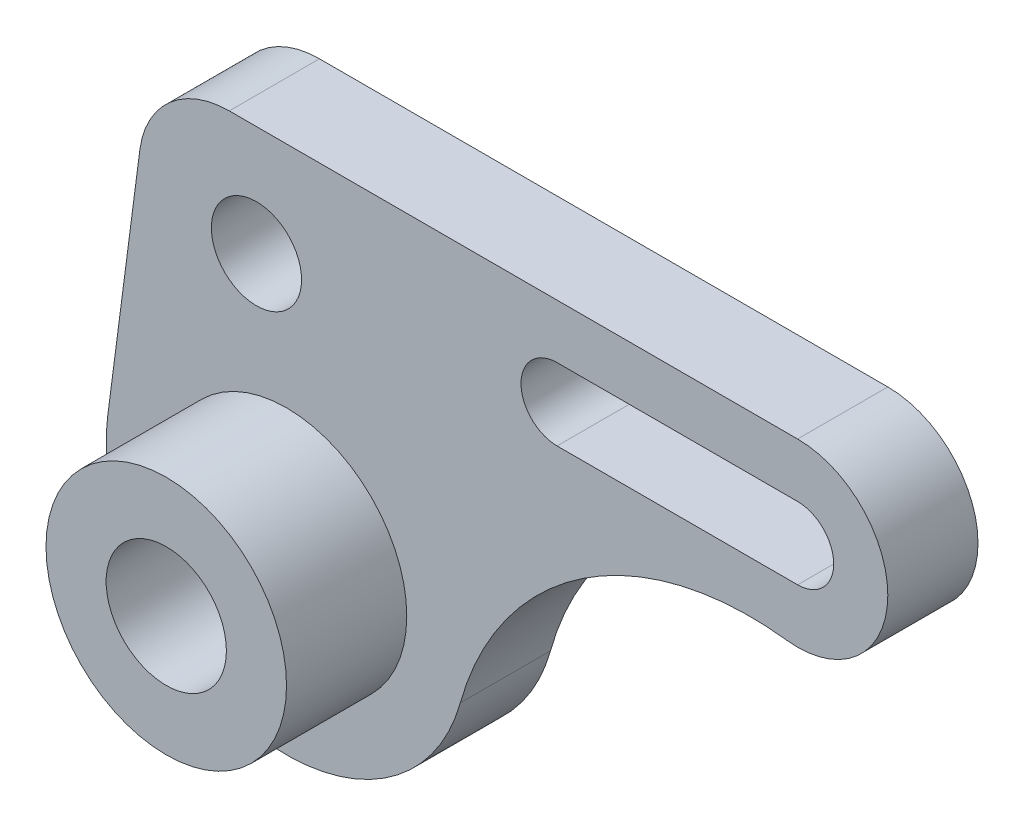
ISO-10303-21;
HEADER;
FILE_DESCRIPTION(('STEP AP214'),'2;1');
FILE_NAME('part.step','',(''),(''),'','','');
FILE_SCHEMA(('AUTOMOTIVE_DESIGN { 1 0 10303 214 1 1 1 1 }'));
ENDSEC;
DATA;
#1=APPLICATION_CONTEXT('core data for automotive mechanical design processes');
#2=APPLICATION_PROTOCOL_DEFINITION('international standard','automotive_design',2000,#1);
#3=PRODUCT_CONTEXT('',#1,'mechanical');
#4=PRODUCT('Part','Part','',(#3));
#5=PRODUCT_RELATED_PRODUCT_CATEGORY('part','',(#4));
#6=PRODUCT_DEFINITION_FORMATION('','',#4);
#7=PRODUCT_DEFINITION_CONTEXT('part definition',#1,'design');
#8=PRODUCT_DEFINITION('design','',#6,#7);
#9=PRODUCT_DEFINITION_SHAPE('','',#8);
#10=(LENGTH_UNIT() NAMED_UNIT(*) SI_UNIT(.MILLI.,.METRE.));
#11=(NAMED_UNIT(*) PLANE_ANGLE_UNIT() SI_UNIT($,.RADIAN.));
#12=(NAMED_UNIT(*) SI_UNIT($,.STERADIAN.) SOLID_ANGLE_UNIT());
#13=UNCERTAINTY_MEASURE_WITH_UNIT(LENGTH_MEASURE(1.E-05),#10,'distance_accuracy_value','');
#14=(GEOMETRIC_REPRESENTATION_CONTEXT(3) GLOBAL_UNCERTAINTY_ASSIGNED_CONTEXT((#13)) GLOBAL_UNIT_ASSIGNED_CONTEXT((#10,
#11,#12)) REPRESENTATION_CONTEXT('',''));
#15=CARTESIAN_POINT('',(0.,0.,0.));
#16=DIRECTION('',(0.,0.,1.));
#17=DIRECTION('',(1.,0.,0.));
#18=AXIS2_PLACEMENT_3D('',#15,#16,#17);
#19=CARTESIAN_POINT('',(-9.51937082683579,43.0012242569308,15.));
#20=DIRECTION('',(0.,0.,-1.));
#21=DIRECTION('',(-1.,0.,0.));
#22=AXIS2_PLACEMENT_3D('',#19,#20,#21);
#23=CYLINDRICAL_SURFACE('',#22,15.);
#24=CARTESIAN_POINT('',(-9.51937082683579,43.0012242569308,0.));
#25=DIRECTION('',(0.,0.,1.));
#26=DIRECTION('',(-1.,0.,0.));
#27=AXIS2_PLACEMENT_3D('',#24,#25,#26);
#28=CIRCLE('',#27,15.);
#29=CARTESIAN_POINT('',(-9.5193708268357,58.0012242569308,0.));
#30=VERTEX_POINT('',#29);
#31=CARTESIAN_POINT('',(-24.3934311160689,44.9408970417732,0.));
#32=VERTEX_POINT('',#31);
#33=EDGE_CURVE('E167',#30,#32,#28,.T.);
#34=ORIENTED_EDGE('',*,*,#33,.T.);
#35=DIRECTION('',(0.,0.,-1.));
#36=VECTOR('',#35,1.);
#37=CARTESIAN_POINT('',(-24.3934311160689,44.9408970417732,15.));
#38=LINE('',#37,#36);
#39=CARTESIAN_POINT('',(-24.3934311160689,44.9408970417732,15.));
#40=VERTEX_POINT('',#39);
#41=EDGE_CURVE('E44',#40,#32,#38,.T.);
#42=ORIENTED_EDGE('',*,*,#41,.F.);
#43=CARTESIAN_POINT('',(-9.51937082683579,43.0012242569308,15.));
#44=DIRECTION('',(0.,0.,1.));
#45=DIRECTION('',(-1.,0.,0.));
#46=AXIS2_PLACEMENT_3D('',#43,#44,#45);
#47=CIRCLE('',#46,15.);
#48=CARTESIAN_POINT('',(-9.5193708268357,58.0012242569308,15.));
#49=VERTEX_POINT('',#48);
#50=EDGE_CURVE('E152',#49,#40,#47,.T.);
#51=ORIENTED_EDGE('',*,*,#50,.F.);
#52=DIRECTION('',(0.,0.,-1.));
#53=VECTOR('',#52,1.);
#54=CARTESIAN_POINT('',(-9.5193708268357,58.0012242569308,15.));
#55=LINE('',#54,#53);
#56=EDGE_CURVE('E166',#49,#30,#55,.T.);
#57=ORIENTED_EDGE('',*,*,#56,.T.);
#58=EDGE_LOOP('',(#34,#42,#51,#57));
#59=FACE_BOUND('',#58,.T.);
#60=ADVANCED_FACE('F37',(#59),#23,.T.);
#61=CARTESIAN_POINT('',(-29.7481205784662,3.87934556968499,15.));
#62=DIRECTION('',(0.991604019282207,-0.1293115189895,0.));
#63=DIRECTION('',(0.1293115189895,0.991604019282207,0.));
#64=AXIS2_PLACEMENT_3D('',#61,#62,#63);
#65=PLANE('',#64);
#66=DIRECTION('',(-0.1293115189895,-0.991604019282207,0.));
#67=VECTOR('',#66,1.);
#68=CARTESIAN_POINT('',(-29.7481205784662,3.87934556968499,0.));
#69=LINE('',#68,#67);
#70=CARTESIAN_POINT('',(-29.7481205784662,3.87934556968499,0.));
#71=VERTEX_POINT('',#70);
#72=EDGE_CURVE('E170',#32,#71,#69,.T.);
#73=ORIENTED_EDGE('',*,*,#72,.T.);
#74=DIRECTION('',(0.,0.,-1.));
#75=VECTOR('',#74,1.);
#76=CARTESIAN_POINT('',(-29.7481205784662,3.87934556968499,15.));
#77=LINE('',#76,#75);
#78=CARTESIAN_POINT('',(-29.7481205784662,3.87934556968499,15.));
#79=VERTEX_POINT('',#78);
#80=EDGE_CURVE('E191',#79,#71,#77,.T.);
#81=ORIENTED_EDGE('',*,*,#80,.F.);
#82=DIRECTION('',(-0.1293115189895,-0.991604019282207,0.));
#83=VECTOR('',#82,1.);
#84=CARTESIAN_POINT('',(-29.7481205784662,3.87934556968499,15.));
#85=LINE('',#84,#83);
#86=EDGE_CURVE('E155',#40,#79,#85,.T.);
#87=ORIENTED_EDGE('',*,*,#86,.F.);
#88=ORIENTED_EDGE('',*,*,#41,.T.);
#89=EDGE_LOOP('',(#73,#81,#87,#88));
#90=FACE_BOUND('',#89,.T.);
#91=ADVANCED_FACE('F196',(#90),#65,.F.);
#92=CARTESIAN_POINT('',(0.,0.,15.));
#93=DIRECTION('',(0.,0.,-1.));
#94=DIRECTION('',(-1.,0.,0.));
#95=AXIS2_PLACEMENT_3D('',#92,#93,#94);
#96=CYLINDRICAL_SURFACE('',#95,30.);
#97=CARTESIAN_POINT('',(0.,0.,0.));
#98=DIRECTION('',(0.,0.,1.));
#99=DIRECTION('',(1.,0.,0.));
#100=AXIS2_PLACEMENT_3D('',#97,#98,#99);
#101=CIRCLE('',#100,30.);
#102=CARTESIAN_POINT('',(28.8951244348913,-8.06670836786278,0.));
#103=VERTEX_POINT('',#102);
#104=EDGE_CURVE('E173',#71,#103,#101,.T.);
#105=ORIENTED_EDGE('',*,*,#104,.T.);
#106=DIRECTION('',(0.,0.,-1.));
#107=VECTOR('',#106,1.);
#108=CARTESIAN_POINT('',(28.8951244348913,-8.06670836786278,15.));
#109=LINE('',#108,#107);
#110=CARTESIAN_POINT('',(28.8951244348913,-8.06670836786278,15.));
#111=VERTEX_POINT('',#110);
#112=EDGE_CURVE('E188',#111,#103,#109,.T.);
#113=ORIENTED_EDGE('',*,*,#112,.F.);
#114=CARTESIAN_POINT('',(0.,0.,15.));
#115=DIRECTION('',(0.,0.,1.));
#116=DIRECTION('',(1.,0.,0.));
#117=AXIS2_PLACEMENT_3D('',#114,#115,#116);
#118=CIRCLE('',#117,30.);
#119=EDGE_CURVE('E158',#79,#111,#118,.T.);
#120=ORIENTED_EDGE('',*,*,#119,.F.);
#121=ORIENTED_EDGE('',*,*,#80,.T.);
#122=EDGE_LOOP('',(#105,#113,#120,#121));
#123=FACE_BOUND('',#122,.T.);
#124=ADVANCED_FACE('F208',(#123),#96,.T.);
#125=CARTESIAN_POINT('',(77.0536651597102,-21.5112223143007,15.));
#126=DIRECTION('',(0.,0.,-1.));
#127=DIRECTION('',(-1.,0.,0.));
#128=AXIS2_PLACEMENT_3D('',#125,#126,#127);
#129=CYLINDRICAL_SURFACE('',#128,50.);
#130=CARTESIAN_POINT('',(77.0536651597102,-21.5112223143007,0.));
#131=DIRECTION('',(0.,0.,-1.));
#132=DIRECTION('',(1.,0.,0.));
#133=AXIS2_PLACEMENT_3D('',#130,#131,#132);
#134=CIRCLE('',#133,50.);
#135=CARTESIAN_POINT('',(83.1662304214716,28.1137365866466,0.));
#136=VERTEX_POINT('',#135);
#137=EDGE_CURVE('E175',#103,#136,#134,.T.);
#138=ORIENTED_EDGE('',*,*,#137,.T.);
#139=DIRECTION('',(0.,0.,-1.));
#140=VECTOR('',#139,1.);
#141=CARTESIAN_POINT('',(83.1662304214716,28.1137365866466,15.));
#142=LINE('',#141,#140);
#143=CARTESIAN_POINT('',(83.1662304214716,28.1137365866466,15.));
#144=VERTEX_POINT('',#143);
#145=EDGE_CURVE('E185',#144,#136,#142,.T.);
#146=ORIENTED_EDGE('',*,*,#145,.F.);
#147=CARTESIAN_POINT('',(77.0536651597102,-21.5112223143007,15.));
#148=DIRECTION('',(0.,0.,-1.));
#149=DIRECTION('',(1.,0.,0.));
#150=AXIS2_PLACEMENT_3D('',#147,#148,#149);
#151=CIRCLE('',#150,50.);
#152=EDGE_CURVE('E160',#111,#144,#151,.T.);
#153=ORIENTED_EDGE('',*,*,#152,.F.);
#154=ORIENTED_EDGE('',*,*,#112,.T.);
#155=EDGE_LOOP('',(#138,#146,#153,#154));
#156=FACE_BOUND('',#155,.T.);
#157=ADVANCED_FACE('F212',(#156),#129,.F.);
#158=CARTESIAN_POINT('',(85.,43.0012242569308,15.));
#159=DIRECTION('',(0.,0.,-1.));
#160=DIRECTION('',(-1.,0.,0.));
#161=AXIS2_PLACEMENT_3D('',#158,#159,#160);
#162=CYLINDRICAL_SURFACE('',#161,15.);
#163=CARTESIAN_POINT('',(85.,43.0012242569308,0.));
#164=DIRECTION('',(0.,0.,1.));
#165=DIRECTION('',(-1.,0.,0.));
#166=AXIS2_PLACEMENT_3D('',#163,#164,#165);
#167=CIRCLE('',#166,15.);
#168=CARTESIAN_POINT('',(85.,58.0012242569308,0.));
#169=VERTEX_POINT('',#168);
#170=EDGE_CURVE('E177',#136,#169,#167,.T.);
#171=ORIENTED_EDGE('',*,*,#170,.T.);
#172=DIRECTION('',(0.,0.,-1.));
#173=VECTOR('',#172,1.);
#174=CARTESIAN_POINT('',(85.,58.0012242569308,15.));
#175=LINE('',#174,#173);
#176=CARTESIAN_POINT('',(85.,58.0012242569308,15.));
#177=VERTEX_POINT('',#176);
#178=EDGE_CURVE('E182',#177,#169,#175,.T.);
#179=ORIENTED_EDGE('',*,*,#178,.F.);
#180=CARTESIAN_POINT('',(85.,43.0012242569308,15.));
#181=DIRECTION('',(0.,0.,1.));
#182=DIRECTION('',(-1.,0.,0.));
#183=AXIS2_PLACEMENT_3D('',#180,#181,#182);
#184=CIRCLE('',#183,15.);
#185=EDGE_CURVE('E162',#144,#177,#184,.T.);
#186=ORIENTED_EDGE('',*,*,#185,.F.);
#187=ORIENTED_EDGE('',*,*,#145,.T.);
#188=EDGE_LOOP('',(#171,#179,#186,#187));
#189=FACE_BOUND('',#188,.T.);
#190=ADVANCED_FACE('F222',(#189),#162,.T.);
#191=CARTESIAN_POINT('',(-9.5193708268357,58.0012242569308,15.));
#192=DIRECTION('',(0.,-1.,0.));
#193=DIRECTION('',(0.,0.,-1.));
#194=AXIS2_PLACEMENT_3D('',#191,#192,#193);
#195=PLANE('',#194);
#196=DIRECTION('',(-1.,0.,0.));
#197=VECTOR('',#196,1.);
#198=CARTESIAN_POINT('',(-9.5193708268357,58.0012242569308,0.));
#199=LINE('',#198,#197);
#200=EDGE_CURVE('E156',#169,#30,#199,.T.);
#201=ORIENTED_EDGE('',*,*,#200,.T.);
#202=ORIENTED_EDGE('',*,*,#56,.F.);
#203=DIRECTION('',(-1.,0.,0.));
#204=VECTOR('',#203,1.);
#205=CARTESIAN_POINT('',(-9.5193708268357,58.0012242569308,15.));
#206=LINE('',#205,#204);
#207=EDGE_CURVE('E164',#177,#49,#206,.T.);
#208=ORIENTED_EDGE('',*,*,#207,.F.);
#209=ORIENTED_EDGE('',*,*,#178,.T.);
#210=EDGE_LOOP('',(#201,#202,#208,#209));
#211=FACE_BOUND('',#210,.T.);
#212=ADVANCED_FACE('F220',(#211),#195,.F.);
#213=CARTESIAN_POINT('',(-9.51937082683579,43.0012242569308,15.));
#214=DIRECTION('',(0.,0.,-1.));
#215=DIRECTION('',(-1.,0.,0.));
#216=AXIS2_PLACEMENT_3D('',#213,#214,#215);
#217=PLANE('',#216);
#218=CARTESIAN_POINT('',(0.,0.,15.));
#219=DIRECTION('',(0.,0.,-1.));
#220=DIRECTION('',(-1.,0.,0.));
#221=AXIS2_PLACEMENT_3D('',#218,#219,#220);
#222=CIRCLE('',#221,20.);
#223=CARTESIAN_POINT('',(-20.,0.,15.));
#224=VERTEX_POINT('',#223);
#225=EDGE_CURVE('E11',#224,#224,#222,.F.);
#226=ORIENTED_EDGE('',*,*,#225,.F.);
#227=EDGE_LOOP('',(#226));
#228=FACE_BOUND('',#227,.T.);
#229=CARTESIAN_POINT('',(-5.00000000000001,39.6862696659689,15.));
#230=DIRECTION('',(0.,0.,1.));
#231=DIRECTION('',(1.,0.,0.));
#232=AXIS2_PLACEMENT_3D('',#229,#230,#231);
#233=CIRCLE('',#232,7.5);
#234=CARTESIAN_POINT('',(2.49999999999999,39.6862696659689,15.));
#235=VERTEX_POINT('',#234);
#236=EDGE_CURVE('E136',#235,#235,#233,.T.);
#237=ORIENTED_EDGE('',*,*,#236,.F.);
#238=EDGE_LOOP('',(#237));
#239=FACE_BOUND('',#238,.T.);
#240=CARTESIAN_POINT('',(45.,43.0012242569308,15.));
#241=DIRECTION('',(0.,0.,1.));
#242=DIRECTION('',(1.,0.,0.));
#243=AXIS2_PLACEMENT_3D('',#240,#241,#242);
#244=CIRCLE('',#243,6.);
#245=CARTESIAN_POINT('',(45.,49.0012242569308,15.));
#246=VERTEX_POINT('',#245);
#247=CARTESIAN_POINT('',(45.,37.0012242569308,15.));
#248=VERTEX_POINT('',#247);
#249=EDGE_CURVE('E142',#246,#248,#244,.T.);
#250=ORIENTED_EDGE('',*,*,#249,.F.);
#251=DIRECTION('',(-1.,0.,0.));
#252=VECTOR('',#251,1.);
#253=CARTESIAN_POINT('',(0.,49.0012242569308,15.));
#254=LINE('',#253,#252);
#255=CARTESIAN_POINT('',(85.,49.0012242569308,15.));
#256=VERTEX_POINT('',#255);
#257=EDGE_CURVE('E51',#256,#246,#254,.T.);
#258=ORIENTED_EDGE('',*,*,#257,.F.);
#259=CARTESIAN_POINT('',(85.,43.0012242569308,15.));
#260=DIRECTION('',(0.,0.,1.));
#261=DIRECTION('',(1.,0.,0.));
#262=AXIS2_PLACEMENT_3D('',#259,#260,#261);
#263=CIRCLE('',#262,6.);
#264=CARTESIAN_POINT('',(85.,37.0012242569308,15.));
#265=VERTEX_POINT('',#264);
#266=EDGE_CURVE('E130',#265,#256,#263,.T.);
#267=ORIENTED_EDGE('',*,*,#266,.F.);
#268=DIRECTION('',(-1.,0.,0.));
#269=VECTOR('',#268,1.);
#270=CARTESIAN_POINT('',(0.,37.0012242569308,15.));
#271=LINE('',#270,#269);
#272=EDGE_CURVE('E133',#265,#248,#271,.T.);
#273=ORIENTED_EDGE('',*,*,#272,.T.);
#274=EDGE_LOOP('',(#250,#258,#267,#273));
#275=FACE_BOUND('',#274,.T.);
#276=ORIENTED_EDGE('',*,*,#50,.T.);
#277=ORIENTED_EDGE('',*,*,#86,.T.);
#278=ORIENTED_EDGE('',*,*,#119,.T.);
#279=ORIENTED_EDGE('',*,*,#152,.T.);
#280=ORIENTED_EDGE('',*,*,#185,.T.);
#281=ORIENTED_EDGE('',*,*,#207,.T.);
#282=EDGE_LOOP('',(#276,#277,#278,#279,#280,#281));
#283=FACE_BOUND('',#282,.T.);
#284=ADVANCED_FACE('F216',(#228,#239,#275,#283),#217,.F.);
#285=CARTESIAN_POINT('',(-9.51937082683579,43.0012242569308,0.));
#286=DIRECTION('',(0.,0.,-1.));
#287=DIRECTION('',(-1.,0.,0.));
#288=AXIS2_PLACEMENT_3D('',#285,#286,#287);
#289=PLANE('',#288);
#290=CARTESIAN_POINT('',(0.,0.,0.));
#291=DIRECTION('',(0.,0.,1.));
#292=DIRECTION('',(1.,0.,0.));
#293=AXIS2_PLACEMENT_3D('',#290,#291,#292);
#294=CIRCLE('',#293,10.);
#295=CARTESIAN_POINT('',(10.,0.,0.));
#296=VERTEX_POINT('',#295);
#297=EDGE_CURVE('E356',#296,#296,#294,.T.);
#298=ORIENTED_EDGE('',*,*,#297,.T.);
#299=EDGE_LOOP('',(#298));
#300=FACE_BOUND('',#299,.T.);
#301=CARTESIAN_POINT('',(-5.00000000000001,39.6862696659689,0.));
#302=DIRECTION('',(0.,0.,1.));
#303=DIRECTION('',(1.,0.,0.));
#304=AXIS2_PLACEMENT_3D('',#301,#302,#303);
#305=CIRCLE('',#304,7.5);
#306=CARTESIAN_POINT('',(2.49999999999999,39.6862696659689,0.));
#307=VERTEX_POINT('',#306);
#308=EDGE_CURVE('E171',#307,#307,#305,.T.);
#309=ORIENTED_EDGE('',*,*,#308,.T.);
#310=EDGE_LOOP('',(#309));
#311=FACE_BOUND('',#310,.T.);
#312=DIRECTION('',(-1.,0.,0.));
#313=VECTOR('',#312,1.);
#314=CARTESIAN_POINT('',(0.,49.0012242569308,0.));
#315=LINE('',#314,#313);
#316=CARTESIAN_POINT('',(85.,49.0012242569308,0.));
#317=VERTEX_POINT('',#316);
#318=CARTESIAN_POINT('',(45.,49.0012242569308,0.));
#319=VERTEX_POINT('',#318);
#320=EDGE_CURVE('E115',#317,#319,#315,.T.);
#321=ORIENTED_EDGE('',*,*,#320,.T.);
#322=CARTESIAN_POINT('',(45.,43.0012242569308,0.));
#323=DIRECTION('',(0.,0.,1.));
#324=DIRECTION('',(1.,0.,0.));
#325=AXIS2_PLACEMENT_3D('',#322,#323,#324);
#326=CIRCLE('',#325,6.);
#327=CARTESIAN_POINT('',(45.,37.0012242569308,0.));
#328=VERTEX_POINT('',#327);
#329=EDGE_CURVE('E121',#319,#328,#326,.T.);
#330=ORIENTED_EDGE('',*,*,#329,.T.);
#331=DIRECTION('',(-1.,0.,0.));
#332=VECTOR('',#331,1.);
#333=CARTESIAN_POINT('',(0.,37.0012242569308,0.));
#334=LINE('',#333,#332);
#335=CARTESIAN_POINT('',(85.,37.0012242569308,0.));
#336=VERTEX_POINT('',#335);
#337=EDGE_CURVE('E125',#336,#328,#334,.T.);
#338=ORIENTED_EDGE('',*,*,#337,.F.);
#339=CARTESIAN_POINT('',(85.,43.0012242569308,0.));
#340=DIRECTION('',(0.,0.,1.));
#341=DIRECTION('',(1.,0.,0.));
#342=AXIS2_PLACEMENT_3D('',#339,#340,#341);
#343=CIRCLE('',#342,6.);
#344=EDGE_CURVE('E118',#336,#317,#343,.T.);
#345=ORIENTED_EDGE('',*,*,#344,.T.);
#346=EDGE_LOOP('',(#321,#330,#338,#345));
#347=FACE_BOUND('',#346,.T.);
#348=ORIENTED_EDGE('',*,*,#33,.F.);
#349=ORIENTED_EDGE('',*,*,#200,.F.);
#350=ORIENTED_EDGE('',*,*,#170,.F.);
#351=ORIENTED_EDGE('',*,*,#137,.F.);
#352=ORIENTED_EDGE('',*,*,#104,.F.);
#353=ORIENTED_EDGE('',*,*,#72,.F.);
#354=EDGE_LOOP('',(#348,#349,#350,#351,#352,#353));
#355=FACE_BOUND('',#354,.T.);
#356=ADVANCED_FACE('F127',(#300,#311,#347,#355),#289,.T.);
#357=CARTESIAN_POINT('',(0.,49.0012242569308,0.));
#358=DIRECTION('',(0.,1.,0.));
#359=DIRECTION('',(-1.,0.,0.));
#360=AXIS2_PLACEMENT_3D('',#357,#358,#359);
#361=PLANE('',#360);
#362=ORIENTED_EDGE('',*,*,#257,.T.);
#363=DIRECTION('',(0.,0.,1.));
#364=VECTOR('',#363,1.);
#365=CARTESIAN_POINT('',(45.,49.0012242569308,0.));
#366=LINE('',#365,#364);
#367=EDGE_CURVE('E112',#319,#246,#366,.T.);
#368=ORIENTED_EDGE('',*,*,#367,.F.);
#369=ORIENTED_EDGE('',*,*,#320,.F.);
#370=DIRECTION('',(0.,0.,1.));
#371=VECTOR('',#370,1.);
#372=CARTESIAN_POINT('',(85.,49.0012242569308,0.));
#373=LINE('',#372,#371);
#374=EDGE_CURVE('E147',#317,#256,#373,.T.);
#375=ORIENTED_EDGE('',*,*,#374,.T.);
#376=EDGE_LOOP('',(#362,#368,#369,#375));
#377=FACE_BOUND('',#376,.T.);
#378=ADVANCED_FACE('F113',(#377),#361,.F.);
#379=CARTESIAN_POINT('',(85.,43.0012242569308,0.));
#380=DIRECTION('',(0.,0.,1.));
#381=DIRECTION('',(1.,0.,0.));
#382=AXIS2_PLACEMENT_3D('',#379,#380,#381);
#383=CYLINDRICAL_SURFACE('',#382,6.);
#384=ORIENTED_EDGE('',*,*,#266,.T.);
#385=ORIENTED_EDGE('',*,*,#374,.F.);
#386=ORIENTED_EDGE('',*,*,#344,.F.);
#387=DIRECTION('',(0.,0.,1.));
#388=VECTOR('',#387,1.);
#389=CARTESIAN_POINT('',(85.,37.0012242569308,0.));
#390=LINE('',#389,#388);
#391=EDGE_CURVE('E149',#336,#265,#390,.T.);
#392=ORIENTED_EDGE('',*,*,#391,.T.);
#393=EDGE_LOOP('',(#384,#385,#386,#392));
#394=FACE_BOUND('',#393,.T.);
#395=ADVANCED_FACE('F266',(#394),#383,.F.);
#396=CARTESIAN_POINT('',(0.,37.0012242569308,0.));
#397=DIRECTION('',(0.,1.,0.));
#398=DIRECTION('',(-1.,0.,0.));
#399=AXIS2_PLACEMENT_3D('',#396,#397,#398);
#400=PLANE('',#399);
#401=ORIENTED_EDGE('',*,*,#272,.F.);
#402=ORIENTED_EDGE('',*,*,#391,.F.);
#403=ORIENTED_EDGE('',*,*,#337,.T.);
#404=DIRECTION('',(0.,0.,1.));
#405=VECTOR('',#404,1.);
#406=CARTESIAN_POINT('',(45.,37.0012242569308,0.));
#407=LINE('',#406,#405);
#408=EDGE_CURVE('E59',#328,#248,#407,.T.);
#409=ORIENTED_EDGE('',*,*,#408,.T.);
#410=EDGE_LOOP('',(#401,#402,#403,#409));
#411=FACE_BOUND('',#410,.T.);
#412=ADVANCED_FACE('F277',(#411),#400,.T.);
#413=CARTESIAN_POINT('',(45.,43.0012242569308,0.));
#414=DIRECTION('',(0.,0.,1.));
#415=DIRECTION('',(1.,0.,0.));
#416=AXIS2_PLACEMENT_3D('',#413,#414,#415);
#417=CYLINDRICAL_SURFACE('',#416,6.);
#418=ORIENTED_EDGE('',*,*,#249,.T.);
#419=ORIENTED_EDGE('',*,*,#408,.F.);
#420=ORIENTED_EDGE('',*,*,#329,.F.);
#421=ORIENTED_EDGE('',*,*,#367,.T.);
#422=EDGE_LOOP('',(#418,#419,#420,#421));
#423=FACE_BOUND('',#422,.T.);
#424=ADVANCED_FACE('F122',(#423),#417,.F.);
#425=CARTESIAN_POINT('',(-5.00000000000001,39.6862696659689,0.));
#426=DIRECTION('',(0.,0.,1.));
#427=DIRECTION('',(1.,0.,0.));
#428=AXIS2_PLACEMENT_3D('',#425,#426,#427);
#429=CYLINDRICAL_SURFACE('',#428,7.5);
#430=ORIENTED_EDGE('',*,*,#308,.F.);
#431=EDGE_LOOP('',(#430));
#432=FACE_BOUND('',#431,.T.);
#433=ORIENTED_EDGE('',*,*,#236,.T.);
#434=EDGE_LOOP('',(#433));
#435=FACE_BOUND('',#434,.T.);
#436=ADVANCED_FACE('F296',(#432,#435),#429,.F.);
#437=CARTESIAN_POINT('',(0.,0.,35.));
#438=DIRECTION('',(0.,0.,-1.));
#439=DIRECTION('',(-1.,0.,0.));
#440=AXIS2_PLACEMENT_3D('',#437,#438,#439);
#441=CYLINDRICAL_SURFACE('',#440,20.);
#442=CARTESIAN_POINT('',(0.,0.,35.));
#443=DIRECTION('',(0.,0.,1.));
#444=DIRECTION('',(1.,0.,0.));
#445=AXIS2_PLACEMENT_3D('',#442,#443,#444);
#446=CIRCLE('',#445,20.);
#447=CARTESIAN_POINT('',(20.,0.,35.));
#448=VERTEX_POINT('',#447);
#449=EDGE_CURVE('E143',#448,#448,#446,.T.);
#450=ORIENTED_EDGE('',*,*,#449,.F.);
#451=EDGE_LOOP('',(#450));
#452=FACE_BOUND('',#451,.T.);
#453=ORIENTED_EDGE('',*,*,#225,.T.);
#454=EDGE_LOOP('',(#453));
#455=FACE_BOUND('',#454,.T.);
#456=ADVANCED_FACE('F305',(#452,#455),#441,.T.);
#457=CARTESIAN_POINT('',(0.,0.,35.));
#458=DIRECTION('',(0.,0.,1.));
#459=DIRECTION('',(1.,0.,0.));
#460=AXIS2_PLACEMENT_3D('',#457,#458,#459);
#461=PLANE('',#460);
#462=CARTESIAN_POINT('',(0.,0.,35.));
#463=DIRECTION('',(0.,0.,1.));
#464=DIRECTION('',(1.,0.,0.));
#465=AXIS2_PLACEMENT_3D('',#462,#463,#464);
#466=CIRCLE('',#465,10.);
#467=CARTESIAN_POINT('',(10.,0.,35.));
#468=VERTEX_POINT('',#467);
#469=EDGE_CURVE('E359',#468,#468,#466,.T.);
#470=ORIENTED_EDGE('',*,*,#469,.F.);
#471=EDGE_LOOP('',(#470));
#472=FACE_BOUND('',#471,.T.);
#473=ORIENTED_EDGE('',*,*,#449,.T.);
#474=EDGE_LOOP('',(#473));
#475=FACE_BOUND('',#474,.T.);
#476=ADVANCED_FACE('F322',(#472,#475),#461,.T.);
#477=CARTESIAN_POINT('',(0.,0.,0.));
#478=DIRECTION('',(0.,0.,1.));
#479=DIRECTION('',(1.,0.,0.));
#480=AXIS2_PLACEMENT_3D('',#477,#478,#479);
#481=CYLINDRICAL_SURFACE('',#480,10.);
#482=ORIENTED_EDGE('',*,*,#297,.F.);
#483=EDGE_LOOP('',(#482));
#484=FACE_BOUND('',#483,.T.);
#485=ORIENTED_EDGE('',*,*,#469,.T.);
#486=EDGE_LOOP('',(#485));
#487=FACE_BOUND('',#486,.T.);
#488=ADVANCED_FACE('F339',(#484,#487),#481,.F.);
#489=CLOSED_SHELL('',(#60,#91,#124,#157,#190,#212,#284,#356,#378,#395,#412,#424,#436,#456,#476,#488));
#490=MANIFOLD_SOLID_BREP('B2',#489);
#491=ADVANCED_BREP_SHAPE_REPRESENTATION('',(#18,#490),#14);
#492=SHAPE_DEFINITION_REPRESENTATION(#9,#491);
ENDSEC;
END-ISO-10303-21;
